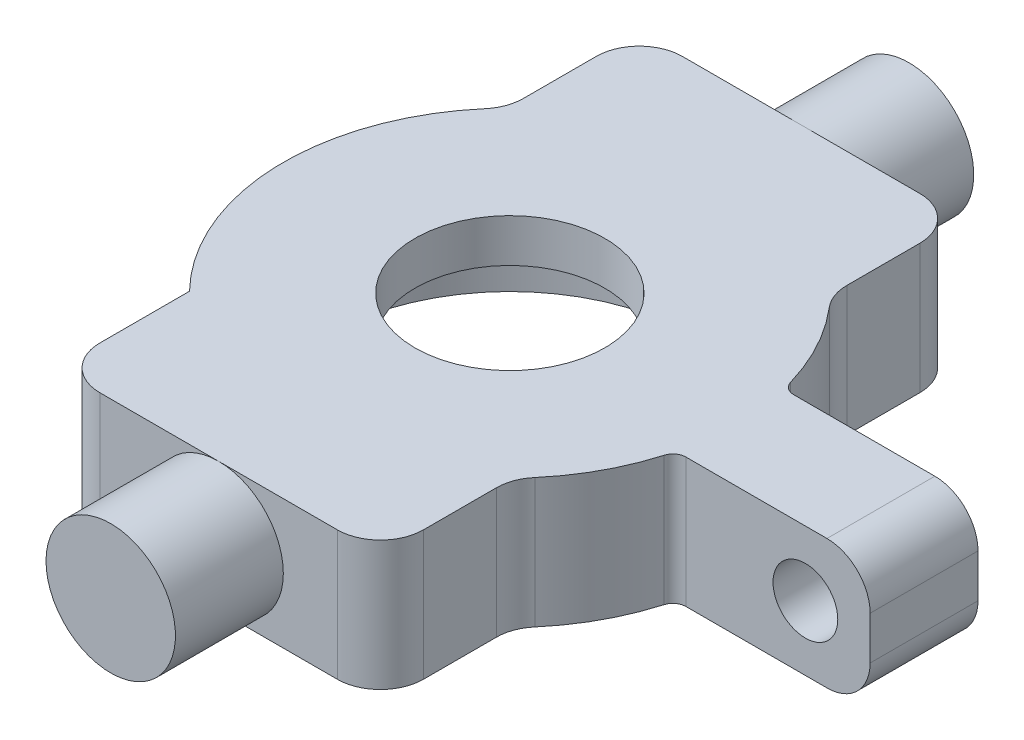
ISO-10303-21;
HEADER;
FILE_DESCRIPTION(('STEP AP214'),'2;1');
FILE_NAME('part.step','',(''),(''),'','','');
FILE_SCHEMA(('AUTOMOTIVE_DESIGN { 1 0 10303 214 1 1 1 1 }'));
ENDSEC;
DATA;
#1=APPLICATION_CONTEXT('core data for automotive mechanical design processes');
#2=APPLICATION_PROTOCOL_DEFINITION('international standard','automotive_design',2000,#1);
#3=PRODUCT_CONTEXT('',#1,'mechanical');
#4=PRODUCT('Part','Part','',(#3));
#5=PRODUCT_RELATED_PRODUCT_CATEGORY('part','',(#4));
#6=PRODUCT_DEFINITION_FORMATION('','',#4);
#7=PRODUCT_DEFINITION_CONTEXT('part definition',#1,'design');
#8=PRODUCT_DEFINITION('design','',#6,#7);
#9=PRODUCT_DEFINITION_SHAPE('','',#8);
#10=(LENGTH_UNIT() NAMED_UNIT(*) SI_UNIT(.MILLI.,.METRE.));
#11=(NAMED_UNIT(*) PLANE_ANGLE_UNIT() SI_UNIT($,.RADIAN.));
#12=(NAMED_UNIT(*) SI_UNIT($,.STERADIAN.) SOLID_ANGLE_UNIT());
#13=UNCERTAINTY_MEASURE_WITH_UNIT(LENGTH_MEASURE(1.E-05),#10,'distance_accuracy_value','');
#14=(GEOMETRIC_REPRESENTATION_CONTEXT(3) GLOBAL_UNCERTAINTY_ASSIGNED_CONTEXT((#13)) GLOBAL_UNIT_ASSIGNED_CONTEXT((#10,
#11,#12)) REPRESENTATION_CONTEXT('',''));
#15=CARTESIAN_POINT('',(0.,0.,0.));
#16=DIRECTION('',(0.,0.,1.));
#17=DIRECTION('',(1.,0.,0.));
#18=AXIS2_PLACEMENT_3D('',#15,#16,#17);
#19=CARTESIAN_POINT('',(0.,30.,0.));
#20=DIRECTION('',(0.,1.,0.));
#21=DIRECTION('',(0.,0.,-1.));
#22=AXIS2_PLACEMENT_3D('',#19,#20,#21);
#23=CYLINDRICAL_SURFACE('',#22,10.5);
#24=CARTESIAN_POINT('',(0.,26.,0.));
#25=DIRECTION('',(0.,1.,0.));
#26=DIRECTION('',(0.,0.,1.));
#27=AXIS2_PLACEMENT_3D('',#24,#25,#26);
#28=CIRCLE('',#27,10.5);
#29=CARTESIAN_POINT('',(10.0822041255481,26.,-2.93243243243243));
#30=VERTEX_POINT('',#29);
#31=CARTESIAN_POINT('',(7.98,26.,-6.82419225989421));
#32=VERTEX_POINT('',#31);
#33=EDGE_CURVE('E403',#30,#32,#28,.T.);
#34=ORIENTED_EDGE('',*,*,#33,.T.);
#35=DIRECTION('',(0.,1.,0.));
#36=VECTOR('',#35,1.);
#37=CARTESIAN_POINT('',(7.98,30.,-6.82419225989421));
#38=LINE('',#37,#36);
#39=CARTESIAN_POINT('',(7.98,32.,-6.82419225989421));
#40=VERTEX_POINT('',#39);
#41=EDGE_CURVE('E333',#40,#32,#38,.F.);
#42=ORIENTED_EDGE('',*,*,#41,.F.);
#43=CARTESIAN_POINT('',(0.,32.,0.));
#44=DIRECTION('',(0.,1.,0.));
#45=DIRECTION('',(0.,0.,1.));
#46=AXIS2_PLACEMENT_3D('',#43,#44,#45);
#47=CIRCLE('',#46,10.5);
#48=CARTESIAN_POINT('',(10.0822041255481,32.,-2.93243243243243));
#49=VERTEX_POINT('',#48);
#50=EDGE_CURVE('E265',#49,#40,#47,.T.);
#51=ORIENTED_EDGE('',*,*,#50,.F.);
#52=DIRECTION('',(0.,1.,0.));
#53=VECTOR('',#52,1.);
#54=CARTESIAN_POINT('',(10.0822041255481,30.,-2.93243243243243));
#55=LINE('',#54,#53);
#56=EDGE_CURVE('E381',#30,#49,#55,.T.);
#57=ORIENTED_EDGE('',*,*,#56,.F.);
#58=EDGE_LOOP('',(#34,#42,#51,#57));
#59=FACE_BOUND('',#58,.T.);
#60=ADVANCED_FACE('F43',(#59),#23,.T.);
#61=CARTESIAN_POINT('',(0.,26.,13.5));
#62=DIRECTION('',(0.,0.,-1.));
#63=DIRECTION('',(-1.,0.,0.));
#64=AXIS2_PLACEMENT_3D('',#61,#62,#63);
#65=PLANE('',#64);
#66=DIRECTION('',(1.,0.,0.));
#67=VECTOR('',#66,1.);
#68=CARTESIAN_POINT('',(0.,32.,13.5));
#69=LINE('',#68,#67);
#70=CARTESIAN_POINT('',(0.,32.,13.5));
#71=VERTEX_POINT('',#70);
#72=CARTESIAN_POINT('',(5.5,32.,13.5));
#73=VERTEX_POINT('',#72);
#74=EDGE_CURVE('E229',#71,#73,#69,.T.);
#75=ORIENTED_EDGE('',*,*,#74,.F.);
#76=CARTESIAN_POINT('',(0.,29.,13.5));
#77=DIRECTION('',(0.,0.,1.));
#78=DIRECTION('',(-1.,0.,0.));
#79=AXIS2_PLACEMENT_3D('',#76,#77,#78);
#80=CIRCLE('',#79,3.);
#81=CARTESIAN_POINT('',(0.,26.,13.5));
#82=VERTEX_POINT('',#81);
#83=EDGE_CURVE('E222',#82,#71,#80,.T.);
#84=ORIENTED_EDGE('',*,*,#83,.F.);
#85=DIRECTION('',(1.,0.,0.));
#86=VECTOR('',#85,1.);
#87=CARTESIAN_POINT('',(0.,26.,13.5));
#88=LINE('',#87,#86);
#89=CARTESIAN_POINT('',(5.5,26.,13.5));
#90=VERTEX_POINT('',#89);
#91=EDGE_CURVE('E445',#82,#90,#88,.T.);
#92=ORIENTED_EDGE('',*,*,#91,.T.);
#93=DIRECTION('',(0.,1.,0.));
#94=VECTOR('',#93,1.);
#95=CARTESIAN_POINT('',(5.5,26.,13.5));
#96=LINE('',#95,#94);
#97=EDGE_CURVE('E244',#73,#90,#96,.F.);
#98=ORIENTED_EDGE('',*,*,#97,.F.);
#99=EDGE_LOOP('',(#75,#84,#92,#98));
#100=FACE_BOUND('',#99,.T.);
#101=ADVANCED_FACE('F242',(#100),#65,.F.);
#102=CARTESIAN_POINT('',(0.,26.,-13.5));
#103=DIRECTION('',(0.,0.,-1.));
#104=DIRECTION('',(-1.,0.,0.));
#105=AXIS2_PLACEMENT_3D('',#102,#103,#104);
#106=PLANE('',#105);
#107=DIRECTION('',(1.,0.,0.));
#108=VECTOR('',#107,1.);
#109=CARTESIAN_POINT('',(0.,26.,-13.5));
#110=LINE('',#109,#108);
#111=CARTESIAN_POINT('',(0.,26.,-13.5));
#112=VERTEX_POINT('',#111);
#113=CARTESIAN_POINT('',(5.5,26.,-13.5));
#114=VERTEX_POINT('',#113);
#115=EDGE_CURVE('E272',#112,#114,#110,.T.);
#116=ORIENTED_EDGE('',*,*,#115,.F.);
#117=CARTESIAN_POINT('',(0.,29.,-13.5));
#118=DIRECTION('',(0.,0.,1.));
#119=DIRECTION('',(-1.,0.,0.));
#120=AXIS2_PLACEMENT_3D('',#117,#118,#119);
#121=CIRCLE('',#120,3.);
#122=CARTESIAN_POINT('',(0.,32.,-13.5));
#123=VERTEX_POINT('',#122);
#124=EDGE_CURVE('E434',#112,#123,#121,.T.);
#125=ORIENTED_EDGE('',*,*,#124,.T.);
#126=DIRECTION('',(1.,0.,0.));
#127=VECTOR('',#126,1.);
#128=CARTESIAN_POINT('',(0.,32.,-13.5));
#129=LINE('',#128,#127);
#130=CARTESIAN_POINT('',(5.5,32.,-13.5));
#131=VERTEX_POINT('',#130);
#132=EDGE_CURVE('E282',#123,#131,#129,.T.);
#133=ORIENTED_EDGE('',*,*,#132,.T.);
#134=DIRECTION('',(0.,1.,0.));
#135=VECTOR('',#134,1.);
#136=CARTESIAN_POINT('',(5.5,26.,-13.5));
#137=LINE('',#136,#135);
#138=EDGE_CURVE('E324',#114,#131,#137,.T.);
#139=ORIENTED_EDGE('',*,*,#138,.F.);
#140=EDGE_LOOP('',(#116,#125,#133,#139));
#141=FACE_BOUND('',#140,.T.);
#142=ADVANCED_FACE('F496',(#141),#106,.T.);
#143=CARTESIAN_POINT('',(0.,30.,0.));
#144=DIRECTION('',(0.,-1.,0.));
#145=DIRECTION('',(0.,0.,1.));
#146=AXIS2_PLACEMENT_3D('',#143,#144,#145);
#147=PLANE('',#146);
#148=CARTESIAN_POINT('',(0.,30.,0.));
#149=DIRECTION('',(0.,1.,0.));
#150=DIRECTION('',(0.,0.,1.));
#151=AXIS2_PLACEMENT_3D('',#148,#149,#150);
#152=CIRCLE('',#151,4.4);
#153=CARTESIAN_POINT('',(0.,30.,4.4));
#154=VERTEX_POINT('',#153);
#155=EDGE_CURVE('E258',#154,#154,#152,.T.);
#156=ORIENTED_EDGE('',*,*,#155,.T.);
#157=EDGE_LOOP('',(#156));
#158=FACE_BOUND('',#157,.T.);
#159=CARTESIAN_POINT('',(0.,30.,0.));
#160=DIRECTION('',(0.,1.,0.));
#161=DIRECTION('',(0.,0.,1.));
#162=AXIS2_PLACEMENT_3D('',#159,#160,#161);
#163=CIRCLE('',#162,8.575);
#164=CARTESIAN_POINT('',(0.,30.,8.575));
#165=VERTEX_POINT('',#164);
#166=EDGE_CURVE('E279',#165,#165,#163,.F.);
#167=ORIENTED_EDGE('',*,*,#166,.T.);
#168=EDGE_LOOP('',(#167));
#169=FACE_BOUND('',#168,.T.);
#170=ADVANCED_FACE('F511',(#158,#169),#147,.T.);
#171=CARTESIAN_POINT('',(-7.98,26.,-6.82419225989421));
#172=VERTEX_POINT('',#171);
#173=CARTESIAN_POINT('',(-7.5,26.,7.34846922834954));
#174=VERTEX_POINT('',#173);
#175=EDGE_CURVE('E405',#172,#174,#28,.T.);
#176=ORIENTED_EDGE('',*,*,#175,.T.);
#177=DIRECTION('',(0.,1.,0.));
#178=VECTOR('',#177,1.);
#179=CARTESIAN_POINT('',(-7.5,26.,7.34846922834954));
#180=LINE('',#179,#178);
#181=CARTESIAN_POINT('',(-7.5,32.,7.34846922834954));
#182=VERTEX_POINT('',#181);
#183=EDGE_CURVE('E253',#174,#182,#180,.T.);
#184=ORIENTED_EDGE('',*,*,#183,.T.);
#185=CARTESIAN_POINT('',(-7.98,32.,-6.82419225989421));
#186=VERTEX_POINT('',#185);
#187=EDGE_CURVE('E262',#186,#182,#47,.T.);
#188=ORIENTED_EDGE('',*,*,#187,.F.);
#189=DIRECTION('',(0.,1.,0.));
#190=VECTOR('',#189,1.);
#191=CARTESIAN_POINT('',(-7.98,30.,-6.82419225989421));
#192=LINE('',#191,#190);
#193=EDGE_CURVE('E219',#172,#186,#192,.T.);
#194=ORIENTED_EDGE('',*,*,#193,.F.);
#195=EDGE_LOOP('',(#176,#184,#188,#194));
#196=FACE_BOUND('',#195,.T.);
#197=ADVANCED_FACE('F465',(#196),#23,.T.);
#198=CARTESIAN_POINT('',(7.5,26.,0.));
#199=DIRECTION('',(1.,0.,0.));
#200=DIRECTION('',(0.,0.,-1.));
#201=AXIS2_PLACEMENT_3D('',#198,#199,#200);
#202=PLANE('',#201);
#203=DIRECTION('',(0.,0.,1.));
#204=VECTOR('',#203,1.);
#205=CARTESIAN_POINT('',(7.5,32.,0.));
#206=LINE('',#205,#204);
#207=CARTESIAN_POINT('',(7.5,32.,-11.5));
#208=VERTEX_POINT('',#207);
#209=CARTESIAN_POINT('',(7.5,32.,-8.12403840463596));
#210=VERTEX_POINT('',#209);
#211=EDGE_CURVE('E261',#208,#210,#206,.T.);
#212=ORIENTED_EDGE('',*,*,#211,.T.);
#213=DIRECTION('',(0.,1.,0.));
#214=VECTOR('',#213,1.);
#215=CARTESIAN_POINT('',(7.5,26.,-8.12403840463596));
#216=LINE('',#215,#214);
#217=CARTESIAN_POINT('',(7.5,26.,-8.12403840463596));
#218=VERTEX_POINT('',#217);
#219=EDGE_CURVE('E327',#218,#210,#216,.T.);
#220=ORIENTED_EDGE('',*,*,#219,.F.);
#221=DIRECTION('',(0.,0.,1.));
#222=VECTOR('',#221,1.);
#223=CARTESIAN_POINT('',(7.5,26.,0.));
#224=LINE('',#223,#222);
#225=CARTESIAN_POINT('',(7.5,26.,-11.5));
#226=VERTEX_POINT('',#225);
#227=EDGE_CURVE('E269',#226,#218,#224,.T.);
#228=ORIENTED_EDGE('',*,*,#227,.F.);
#229=DIRECTION('',(0.,1.,0.));
#230=VECTOR('',#229,1.);
#231=CARTESIAN_POINT('',(7.5,26.,-11.5));
#232=LINE('',#231,#230);
#233=EDGE_CURVE('E330',#208,#226,#232,.F.);
#234=ORIENTED_EDGE('',*,*,#233,.F.);
#235=EDGE_LOOP('',(#212,#220,#228,#234));
#236=FACE_BOUND('',#235,.T.);
#237=ADVANCED_FACE('F503',(#236),#202,.T.);
#238=CARTESIAN_POINT('',(-5.5,32.,-13.5));
#239=VERTEX_POINT('',#238);
#240=EDGE_CURVE('E283',#239,#123,#129,.T.);
#241=ORIENTED_EDGE('',*,*,#240,.T.);
#242=EDGE_CURVE('E220',#123,#112,#121,.T.);
#243=ORIENTED_EDGE('',*,*,#242,.T.);
#244=CARTESIAN_POINT('',(-5.5,26.,-13.5));
#245=VERTEX_POINT('',#244);
#246=EDGE_CURVE('E274',#245,#112,#110,.T.);
#247=ORIENTED_EDGE('',*,*,#246,.F.);
#248=DIRECTION('',(0.,1.,0.));
#249=VECTOR('',#248,1.);
#250=CARTESIAN_POINT('',(-5.5,26.,-13.5));
#251=LINE('',#250,#249);
#252=EDGE_CURVE('E308',#239,#245,#251,.F.);
#253=ORIENTED_EDGE('',*,*,#252,.F.);
#254=EDGE_LOOP('',(#241,#243,#247,#253));
#255=FACE_BOUND('',#254,.T.);
#256=ADVANCED_FACE('F490',(#255),#106,.T.);
#257=CARTESIAN_POINT('',(-7.5,26.,0.));
#258=DIRECTION('',(-1.,0.,0.));
#259=DIRECTION('',(0.,0.,1.));
#260=AXIS2_PLACEMENT_3D('',#257,#258,#259);
#261=PLANE('',#260);
#262=DIRECTION('',(0.,0.,-1.));
#263=VECTOR('',#262,1.);
#264=CARTESIAN_POINT('',(-7.5,32.,0.));
#265=LINE('',#264,#263);
#266=CARTESIAN_POINT('',(-7.5,32.,-8.12403840463596));
#267=VERTEX_POINT('',#266);
#268=CARTESIAN_POINT('',(-7.5,32.,-11.5));
#269=VERTEX_POINT('',#268);
#270=EDGE_CURVE('E273',#267,#269,#265,.T.);
#271=ORIENTED_EDGE('',*,*,#270,.T.);
#272=DIRECTION('',(0.,1.,0.));
#273=VECTOR('',#272,1.);
#274=CARTESIAN_POINT('',(-7.5,26.,-11.5));
#275=LINE('',#274,#273);
#276=CARTESIAN_POINT('',(-7.5,26.,-11.5));
#277=VERTEX_POINT('',#276);
#278=EDGE_CURVE('E292',#277,#269,#275,.T.);
#279=ORIENTED_EDGE('',*,*,#278,.F.);
#280=DIRECTION('',(0.,0.,-1.));
#281=VECTOR('',#280,1.);
#282=CARTESIAN_POINT('',(-7.5,26.,0.));
#283=LINE('',#282,#281);
#284=CARTESIAN_POINT('',(-7.5,26.,-8.12403840463596));
#285=VERTEX_POINT('',#284);
#286=EDGE_CURVE('E276',#285,#277,#283,.T.);
#287=ORIENTED_EDGE('',*,*,#286,.F.);
#288=DIRECTION('',(0.,1.,0.));
#289=VECTOR('',#288,1.);
#290=CARTESIAN_POINT('',(-7.5,26.,-8.12403840463596));
#291=LINE('',#290,#289);
#292=EDGE_CURVE('E295',#267,#285,#291,.F.);
#293=ORIENTED_EDGE('',*,*,#292,.F.);
#294=EDGE_LOOP('',(#271,#279,#287,#293));
#295=FACE_BOUND('',#294,.T.);
#296=ADVANCED_FACE('F482',(#295),#261,.T.);
#297=CARTESIAN_POINT('',(0.,26.,0.));
#298=DIRECTION('',(0.,-1.,0.));
#299=DIRECTION('',(0.,0.,1.));
#300=AXIS2_PLACEMENT_3D('',#297,#298,#299);
#301=PLANE('',#300);
#302=ORIENTED_EDGE('',*,*,#246,.T.);
#303=ORIENTED_EDGE('',*,*,#115,.T.);
#304=CARTESIAN_POINT('',(5.5,26.,-11.5));
#305=DIRECTION('',(0.,1.,0.));
#306=DIRECTION('',(0.,0.,1.));
#307=AXIS2_PLACEMENT_3D('',#304,#305,#306);
#308=CIRCLE('',#307,2.);
#309=EDGE_CURVE('E320',#226,#114,#308,.T.);
#310=ORIENTED_EDGE('',*,*,#309,.F.);
#311=ORIENTED_EDGE('',*,*,#227,.T.);
#312=CARTESIAN_POINT('',(9.5,26.,-8.12403840463596));
#313=DIRECTION('',(0.,1.,0.));
#314=DIRECTION('',(0.,0.,1.));
#315=AXIS2_PLACEMENT_3D('',#312,#313,#314);
#316=CIRCLE('',#315,2.);
#317=EDGE_CURVE('E367',#32,#218,#316,.F.);
#318=ORIENTED_EDGE('',*,*,#317,.F.);
#319=ORIENTED_EDGE('',*,*,#33,.F.);
#320=CARTESIAN_POINT('',(10.6583300755794,26.,-3.1));
#321=DIRECTION('',(0.,1.,0.));
#322=DIRECTION('',(0.,0.,1.));
#323=AXIS2_PLACEMENT_3D('',#320,#321,#322);
#324=CIRCLE('',#323,0.6);
#325=CARTESIAN_POINT('',(10.6583300755794,26.,-2.5));
#326=VERTEX_POINT('',#325);
#327=EDGE_CURVE('E51',#326,#30,#324,.F.);
#328=ORIENTED_EDGE('',*,*,#327,.F.);
#329=DIRECTION('',(-1.,0.,0.));
#330=VECTOR('',#329,1.);
#331=CARTESIAN_POINT('',(10.1980390271856,26.,-2.5));
#332=LINE('',#331,#330);
#333=CARTESIAN_POINT('',(17.1980390271856,26.,-2.5));
#334=VERTEX_POINT('',#333);
#335=EDGE_CURVE('E414',#334,#326,#332,.T.);
#336=ORIENTED_EDGE('',*,*,#335,.F.);
#337=DIRECTION('',(0.,0.,-1.));
#338=VECTOR('',#337,1.);
#339=CARTESIAN_POINT('',(17.1980390271856,26.,0.));
#340=LINE('',#339,#338);
#341=CARTESIAN_POINT('',(17.1980390271856,26.,2.5));
#342=VERTEX_POINT('',#341);
#343=EDGE_CURVE('E311',#342,#334,#340,.T.);
#344=ORIENTED_EDGE('',*,*,#343,.F.);
#345=DIRECTION('',(1.,0.,0.));
#346=VECTOR('',#345,1.);
#347=CARTESIAN_POINT('',(10.1980390271856,26.,2.5));
#348=LINE('',#347,#346);
#349=CARTESIAN_POINT('',(10.6583300755794,26.,2.5));
#350=VERTEX_POINT('',#349);
#351=EDGE_CURVE('E411',#350,#342,#348,.T.);
#352=ORIENTED_EDGE('',*,*,#351,.F.);
#353=CARTESIAN_POINT('',(10.6583300755794,26.,3.1));
#354=DIRECTION('',(0.,1.,0.));
#355=DIRECTION('',(0.,0.,1.));
#356=AXIS2_PLACEMENT_3D('',#353,#354,#355);
#357=CIRCLE('',#356,0.6);
#358=CARTESIAN_POINT('',(10.0822041255481,26.,2.93243243243243));
#359=VERTEX_POINT('',#358);
#360=EDGE_CURVE('E383',#359,#350,#357,.F.);
#361=ORIENTED_EDGE('',*,*,#360,.F.);
#362=CARTESIAN_POINT('',(7.98,26.,6.82419225989421));
#363=VERTEX_POINT('',#362);
#364=EDGE_CURVE('E246',#363,#359,#28,.T.);
#365=ORIENTED_EDGE('',*,*,#364,.F.);
#366=CARTESIAN_POINT('',(9.5,26.,8.12403840463596));
#367=DIRECTION('',(0.,1.,0.));
#368=DIRECTION('',(0.,0.,1.));
#369=AXIS2_PLACEMENT_3D('',#366,#367,#368);
#370=CIRCLE('',#369,2.);
#371=CARTESIAN_POINT('',(7.5,26.,8.12403840463596));
#372=VERTEX_POINT('',#371);
#373=EDGE_CURVE('E372',#372,#363,#370,.F.);
#374=ORIENTED_EDGE('',*,*,#373,.F.);
#375=DIRECTION('',(0.,0.,1.));
#376=VECTOR('',#375,1.);
#377=CARTESIAN_POINT('',(7.5,26.,0.));
#378=LINE('',#377,#376);
#379=CARTESIAN_POINT('',(7.5,26.,11.5));
#380=VERTEX_POINT('',#379);
#381=EDGE_CURVE('E257',#372,#380,#378,.T.);
#382=ORIENTED_EDGE('',*,*,#381,.T.);
#383=CARTESIAN_POINT('',(5.5,26.,11.5));
#384=DIRECTION('',(0.,1.,0.));
#385=DIRECTION('',(0.,0.,1.));
#386=AXIS2_PLACEMENT_3D('',#383,#384,#385);
#387=CIRCLE('',#386,2.);
#388=EDGE_CURVE('E314',#90,#380,#387,.T.);
#389=ORIENTED_EDGE('',*,*,#388,.F.);
#390=ORIENTED_EDGE('',*,*,#91,.F.);
#391=CARTESIAN_POINT('',(-5.5,26.,13.5));
#392=VERTEX_POINT('',#391);
#393=EDGE_CURVE('E215',#392,#82,#88,.T.);
#394=ORIENTED_EDGE('',*,*,#393,.F.);
#395=CARTESIAN_POINT('',(-5.5,26.,11.5));
#396=DIRECTION('',(0.,1.,0.));
#397=DIRECTION('',(0.,0.,1.));
#398=AXIS2_PLACEMENT_3D('',#395,#396,#397);
#399=CIRCLE('',#398,2.);
#400=CARTESIAN_POINT('',(-7.5,26.,11.5));
#401=VERTEX_POINT('',#400);
#402=EDGE_CURVE('E317',#401,#392,#399,.T.);
#403=ORIENTED_EDGE('',*,*,#402,.F.);
#404=DIRECTION('',(0.,0.,-1.));
#405=VECTOR('',#404,1.);
#406=CARTESIAN_POINT('',(-7.5,26.,0.));
#407=LINE('',#406,#405);
#408=EDGE_CURVE('E252',#401,#174,#407,.T.);
#409=ORIENTED_EDGE('',*,*,#408,.T.);
#410=ORIENTED_EDGE('',*,*,#175,.F.);
#411=CARTESIAN_POINT('',(-9.5,26.,-8.12403840463596));
#412=DIRECTION('',(0.,1.,0.));
#413=DIRECTION('',(0.,0.,1.));
#414=AXIS2_PLACEMENT_3D('',#411,#412,#413);
#415=CIRCLE('',#414,2.);
#416=EDGE_CURVE('E363',#285,#172,#415,.F.);
#417=ORIENTED_EDGE('',*,*,#416,.F.);
#418=ORIENTED_EDGE('',*,*,#286,.T.);
#419=CARTESIAN_POINT('',(-5.5,26.,-11.5));
#420=DIRECTION('',(0.,1.,0.));
#421=DIRECTION('',(0.,0.,1.));
#422=AXIS2_PLACEMENT_3D('',#419,#420,#421);
#423=CIRCLE('',#422,2.);
#424=EDGE_CURVE('E322',#245,#277,#423,.T.);
#425=ORIENTED_EDGE('',*,*,#424,.F.);
#426=EDGE_LOOP('',(#302,#303,#310,#311,#318,#319,#328,#336,#344,#352,#361,#365,#374,#382,#389,
#390,#394,#403,#409,#410,#417,#418,#425));
#427=FACE_BOUND('',#426,.T.);
#428=CARTESIAN_POINT('',(0.,26.,0.));
#429=DIRECTION('',(0.,1.,0.));
#430=DIRECTION('',(0.,0.,1.));
#431=AXIS2_PLACEMENT_3D('',#428,#429,#430);
#432=CIRCLE('',#431,8.575);
#433=CARTESIAN_POINT('',(0.,26.,8.575));
#434=VERTEX_POINT('',#433);
#435=EDGE_CURVE('E439',#434,#434,#432,.T.);
#436=ORIENTED_EDGE('',*,*,#435,.T.);
#437=EDGE_LOOP('',(#436));
#438=FACE_BOUND('',#437,.T.);
#439=ADVANCED_FACE('F407',(#427,#438),#301,.T.);
#440=CARTESIAN_POINT('',(0.,32.,0.));
#441=DIRECTION('',(0.,-1.,0.));
#442=DIRECTION('',(0.,0.,1.));
#443=AXIS2_PLACEMENT_3D('',#440,#441,#442);
#444=PLANE('',#443);
#445=ORIENTED_EDGE('',*,*,#270,.F.);
#446=CARTESIAN_POINT('',(-9.5,32.,-8.12403840463596));
#447=DIRECTION('',(0.,1.,0.));
#448=DIRECTION('',(0.,0.,1.));
#449=AXIS2_PLACEMENT_3D('',#446,#447,#448);
#450=CIRCLE('',#449,2.);
#451=EDGE_CURVE('E361',#186,#267,#450,.T.);
#452=ORIENTED_EDGE('',*,*,#451,.F.);
#453=ORIENTED_EDGE('',*,*,#187,.T.);
#454=DIRECTION('',(0.,0.,-1.));
#455=VECTOR('',#454,1.);
#456=CARTESIAN_POINT('',(-7.5,32.,0.));
#457=LINE('',#456,#455);
#458=CARTESIAN_POINT('',(-7.5,32.,11.5));
#459=VERTEX_POINT('',#458);
#460=EDGE_CURVE('E245',#459,#182,#457,.T.);
#461=ORIENTED_EDGE('',*,*,#460,.F.);
#462=CARTESIAN_POINT('',(-5.5,32.,11.5));
#463=DIRECTION('',(0.,1.,0.));
#464=DIRECTION('',(0.,0.,1.));
#465=AXIS2_PLACEMENT_3D('',#462,#463,#464);
#466=CIRCLE('',#465,2.);
#467=CARTESIAN_POINT('',(-5.5,32.,13.5));
#468=VERTEX_POINT('',#467);
#469=EDGE_CURVE('E232',#468,#459,#466,.F.);
#470=ORIENTED_EDGE('',*,*,#469,.F.);
#471=EDGE_CURVE('E212',#468,#71,#69,.T.);
#472=ORIENTED_EDGE('',*,*,#471,.T.);
#473=ORIENTED_EDGE('',*,*,#74,.T.);
#474=CARTESIAN_POINT('',(5.5,32.,11.5));
#475=DIRECTION('',(0.,1.,0.));
#476=DIRECTION('',(0.,0.,1.));
#477=AXIS2_PLACEMENT_3D('',#474,#475,#476);
#478=CIRCLE('',#477,2.);
#479=CARTESIAN_POINT('',(7.5,32.,11.5));
#480=VERTEX_POINT('',#479);
#481=EDGE_CURVE('E301',#480,#73,#478,.F.);
#482=ORIENTED_EDGE('',*,*,#481,.F.);
#483=DIRECTION('',(0.,0.,1.));
#484=VECTOR('',#483,1.);
#485=CARTESIAN_POINT('',(7.5,32.,0.));
#486=LINE('',#485,#484);
#487=CARTESIAN_POINT('',(7.5,32.,8.12403840463596));
#488=VERTEX_POINT('',#487);
#489=EDGE_CURVE('E233',#488,#480,#486,.T.);
#490=ORIENTED_EDGE('',*,*,#489,.F.);
#491=CARTESIAN_POINT('',(9.5,32.,8.12403840463596));
#492=DIRECTION('',(0.,1.,0.));
#493=DIRECTION('',(0.,0.,1.));
#494=AXIS2_PLACEMENT_3D('',#491,#492,#493);
#495=CIRCLE('',#494,2.);
#496=CARTESIAN_POINT('',(7.98,32.,6.82419225989421));
#497=VERTEX_POINT('',#496);
#498=EDGE_CURVE('E369',#497,#488,#495,.T.);
#499=ORIENTED_EDGE('',*,*,#498,.F.);
#500=CARTESIAN_POINT('',(10.0822041255481,32.,2.93243243243243));
#501=VERTEX_POINT('',#500);
#502=EDGE_CURVE('E266',#497,#501,#47,.T.);
#503=ORIENTED_EDGE('',*,*,#502,.T.);
#504=CARTESIAN_POINT('',(10.6583300755794,32.,3.1));
#505=DIRECTION('',(0.,1.,0.));
#506=DIRECTION('',(0.,0.,1.));
#507=AXIS2_PLACEMENT_3D('',#504,#505,#506);
#508=CIRCLE('',#507,0.6);
#509=CARTESIAN_POINT('',(10.6583300755794,32.,2.5));
#510=VERTEX_POINT('',#509);
#511=EDGE_CURVE('E386',#510,#501,#508,.T.);
#512=ORIENTED_EDGE('',*,*,#511,.F.);
#513=DIRECTION('',(-1.,0.,0.));
#514=VECTOR('',#513,1.);
#515=CARTESIAN_POINT('',(10.1980390271856,32.,2.5));
#516=LINE('',#515,#514);
#517=CARTESIAN_POINT('',(17.1980390271856,32.,2.5));
#518=VERTEX_POINT('',#517);
#519=EDGE_CURVE('E240',#518,#510,#516,.T.);
#520=ORIENTED_EDGE('',*,*,#519,.F.);
#521=DIRECTION('',(0.,0.,1.));
#522=VECTOR('',#521,1.);
#523=CARTESIAN_POINT('',(17.1980390271856,32.,2.5));
#524=LINE('',#523,#522);
#525=CARTESIAN_POINT('',(17.1980390271856,32.,-2.5));
#526=VERTEX_POINT('',#525);
#527=EDGE_CURVE('E298',#526,#518,#524,.T.);
#528=ORIENTED_EDGE('',*,*,#527,.F.);
#529=DIRECTION('',(1.,0.,0.));
#530=VECTOR('',#529,1.);
#531=CARTESIAN_POINT('',(10.1980390271856,32.,-2.5));
#532=LINE('',#531,#530);
#533=CARTESIAN_POINT('',(10.6583300755794,32.,-2.5));
#534=VERTEX_POINT('',#533);
#535=EDGE_CURVE('E424',#534,#526,#532,.T.);
#536=ORIENTED_EDGE('',*,*,#535,.F.);
#537=CARTESIAN_POINT('',(10.6583300755794,32.,-3.1));
#538=DIRECTION('',(0.,1.,0.));
#539=DIRECTION('',(0.,0.,1.));
#540=AXIS2_PLACEMENT_3D('',#537,#538,#539);
#541=CIRCLE('',#540,0.6);
#542=EDGE_CURVE('E11',#49,#534,#541,.T.);
#543=ORIENTED_EDGE('',*,*,#542,.F.);
#544=ORIENTED_EDGE('',*,*,#50,.T.);
#545=CARTESIAN_POINT('',(9.5,32.,-8.12403840463596));
#546=DIRECTION('',(0.,1.,0.));
#547=DIRECTION('',(0.,0.,1.));
#548=AXIS2_PLACEMENT_3D('',#545,#546,#547);
#549=CIRCLE('',#548,2.);
#550=EDGE_CURVE('E365',#210,#40,#549,.T.);
#551=ORIENTED_EDGE('',*,*,#550,.F.);
#552=ORIENTED_EDGE('',*,*,#211,.F.);
#553=CARTESIAN_POINT('',(5.5,32.,-11.5));
#554=DIRECTION('',(0.,1.,0.));
#555=DIRECTION('',(0.,0.,1.));
#556=AXIS2_PLACEMENT_3D('',#553,#554,#555);
#557=CIRCLE('',#556,2.);
#558=EDGE_CURVE('E304',#131,#208,#557,.F.);
#559=ORIENTED_EDGE('',*,*,#558,.F.);
#560=ORIENTED_EDGE('',*,*,#132,.F.);
#561=ORIENTED_EDGE('',*,*,#240,.F.);
#562=CARTESIAN_POINT('',(-5.5,32.,-11.5));
#563=DIRECTION('',(0.,1.,0.));
#564=DIRECTION('',(0.,0.,1.));
#565=AXIS2_PLACEMENT_3D('',#562,#563,#564);
#566=CIRCLE('',#565,2.);
#567=EDGE_CURVE('E306',#269,#239,#566,.F.);
#568=ORIENTED_EDGE('',*,*,#567,.F.);
#569=EDGE_LOOP('',(#445,#452,#453,#461,#470,#472,#473,#482,#490,#499,#503,#512,#520,#528,#536,
#543,#544,#551,#552,#559,#560,#561,#568));
#570=FACE_BOUND('',#569,.T.);
#571=CARTESIAN_POINT('',(0.,32.,0.));
#572=DIRECTION('',(0.,1.,0.));
#573=DIRECTION('',(0.,0.,1.));
#574=AXIS2_PLACEMENT_3D('',#571,#572,#573);
#575=CIRCLE('',#574,4.4);
#576=CARTESIAN_POINT('',(0.,32.,4.4));
#577=VERTEX_POINT('',#576);
#578=EDGE_CURVE('E256',#577,#577,#575,.T.);
#579=ORIENTED_EDGE('',*,*,#578,.F.);
#580=EDGE_LOOP('',(#579));
#581=FACE_BOUND('',#580,.T.);
#582=ADVANCED_FACE('F225',(#570,#581),#444,.F.);
#583=CARTESIAN_POINT('',(0.,30.,0.));
#584=DIRECTION('',(0.,1.,0.));
#585=DIRECTION('',(0.,0.,-1.));
#586=AXIS2_PLACEMENT_3D('',#583,#584,#585);
#587=CYLINDRICAL_SURFACE('',#586,4.4);
#588=ORIENTED_EDGE('',*,*,#155,.F.);
#589=EDGE_LOOP('',(#588));
#590=FACE_BOUND('',#589,.T.);
#591=ORIENTED_EDGE('',*,*,#578,.T.);
#592=EDGE_LOOP('',(#591));
#593=FACE_BOUND('',#592,.T.);
#594=ADVANCED_FACE('F522',(#590,#593),#587,.F.);
#595=ORIENTED_EDGE('',*,*,#502,.F.);
#596=DIRECTION('',(0.,1.,0.));
#597=VECTOR('',#596,1.);
#598=CARTESIAN_POINT('',(7.98,30.,6.82419225989421));
#599=LINE('',#598,#597);
#600=EDGE_CURVE('E336',#363,#497,#599,.T.);
#601=ORIENTED_EDGE('',*,*,#600,.F.);
#602=ORIENTED_EDGE('',*,*,#364,.T.);
#603=DIRECTION('',(0.,1.,0.));
#604=VECTOR('',#603,1.);
#605=CARTESIAN_POINT('',(10.0822041255481,30.,2.93243243243243));
#606=LINE('',#605,#604);
#607=EDGE_CURVE('E375',#501,#359,#606,.F.);
#608=ORIENTED_EDGE('',*,*,#607,.F.);
#609=EDGE_LOOP('',(#595,#601,#602,#608));
#610=FACE_BOUND('',#609,.T.);
#611=ADVANCED_FACE('F398',(#610),#23,.T.);
#612=CARTESIAN_POINT('',(-7.5,26.,0.));
#613=DIRECTION('',(-1.,0.,0.));
#614=DIRECTION('',(0.,0.,1.));
#615=AXIS2_PLACEMENT_3D('',#612,#613,#614);
#616=PLANE('',#615);
#617=ORIENTED_EDGE('',*,*,#460,.T.);
#618=ORIENTED_EDGE('',*,*,#183,.F.);
#619=ORIENTED_EDGE('',*,*,#408,.F.);
#620=DIRECTION('',(0.,1.,0.));
#621=VECTOR('',#620,1.);
#622=CARTESIAN_POINT('',(-7.5,26.,11.5));
#623=LINE('',#622,#621);
#624=EDGE_CURVE('E344',#459,#401,#623,.F.);
#625=ORIENTED_EDGE('',*,*,#624,.F.);
#626=EDGE_LOOP('',(#617,#618,#619,#625));
#627=FACE_BOUND('',#626,.T.);
#628=ADVANCED_FACE('F459',(#627),#616,.T.);
#629=ORIENTED_EDGE('',*,*,#393,.T.);
#630=EDGE_CURVE('E209',#71,#82,#80,.T.);
#631=ORIENTED_EDGE('',*,*,#630,.F.);
#632=ORIENTED_EDGE('',*,*,#471,.F.);
#633=DIRECTION('',(0.,1.,0.));
#634=VECTOR('',#633,1.);
#635=CARTESIAN_POINT('',(-5.5,32.,13.5));
#636=LINE('',#635,#634);
#637=EDGE_CURVE('E342',#392,#468,#636,.T.);
#638=ORIENTED_EDGE('',*,*,#637,.F.);
#639=EDGE_LOOP('',(#629,#631,#632,#638));
#640=FACE_BOUND('',#639,.T.);
#641=ADVANCED_FACE('F211',(#640),#65,.F.);
#642=CARTESIAN_POINT('',(7.5,26.,0.));
#643=DIRECTION('',(1.,0.,0.));
#644=DIRECTION('',(0.,0.,-1.));
#645=AXIS2_PLACEMENT_3D('',#642,#643,#644);
#646=PLANE('',#645);
#647=ORIENTED_EDGE('',*,*,#489,.T.);
#648=DIRECTION('',(0.,1.,0.));
#649=VECTOR('',#648,1.);
#650=CARTESIAN_POINT('',(7.5,32.,11.5));
#651=LINE('',#650,#649);
#652=EDGE_CURVE('E338',#380,#480,#651,.T.);
#653=ORIENTED_EDGE('',*,*,#652,.F.);
#654=ORIENTED_EDGE('',*,*,#381,.F.);
#655=DIRECTION('',(0.,1.,0.));
#656=VECTOR('',#655,1.);
#657=CARTESIAN_POINT('',(7.5,26.,8.12403840463596));
#658=LINE('',#657,#656);
#659=EDGE_CURVE('E340',#488,#372,#658,.F.);
#660=ORIENTED_EDGE('',*,*,#659,.F.);
#661=EDGE_LOOP('',(#647,#653,#654,#660));
#662=FACE_BOUND('',#661,.T.);
#663=ADVANCED_FACE('F449',(#662),#646,.T.);
#664=CARTESIAN_POINT('',(0.,-3.69848480983501,0.));
#665=DIRECTION('',(0.,1.,0.));
#666=DIRECTION('',(0.,0.,-1.));
#667=AXIS2_PLACEMENT_3D('',#664,#665,#666);
#668=CYLINDRICAL_SURFACE('',#667,8.575);
#669=ORIENTED_EDGE('',*,*,#166,.F.);
#670=EDGE_LOOP('',(#669));
#671=FACE_BOUND('',#670,.T.);
#672=ORIENTED_EDGE('',*,*,#435,.F.);
#673=EDGE_LOOP('',(#672));
#674=FACE_BOUND('',#673,.T.);
#675=ADVANCED_FACE('F605',(#671,#674),#668,.F.);
#676=CARTESIAN_POINT('',(0.,29.,-18.5));
#677=DIRECTION('',(0.,0.,1.));
#678=DIRECTION('',(1.,0.,0.));
#679=AXIS2_PLACEMENT_3D('',#676,#677,#678);
#680=CYLINDRICAL_SURFACE('',#679,3.);
#681=CARTESIAN_POINT('',(0.,29.,-18.5));
#682=DIRECTION('',(0.,0.,1.));
#683=DIRECTION('',(-1.,0.,0.));
#684=AXIS2_PLACEMENT_3D('',#681,#682,#683);
#685=CIRCLE('',#684,3.);
#686=CARTESIAN_POINT('',(-3.,29.,-18.5));
#687=VERTEX_POINT('',#686);
#688=EDGE_CURVE('E436',#687,#687,#685,.T.);
#689=ORIENTED_EDGE('',*,*,#688,.T.);
#690=EDGE_LOOP('',(#689));
#691=FACE_BOUND('',#690,.T.);
#692=ORIENTED_EDGE('',*,*,#124,.F.);
#693=ORIENTED_EDGE('',*,*,#242,.F.);
#694=EDGE_LOOP('',(#692,#693));
#695=FACE_BOUND('',#694,.T.);
#696=ADVANCED_FACE('F618',(#691,#695),#680,.T.);
#697=CARTESIAN_POINT('',(0.,29.,-18.5));
#698=DIRECTION('',(0.,0.,-1.));
#699=DIRECTION('',(-1.,0.,0.));
#700=AXIS2_PLACEMENT_3D('',#697,#698,#699);
#701=PLANE('',#700);
#702=ORIENTED_EDGE('',*,*,#688,.F.);
#703=EDGE_LOOP('',(#702));
#704=FACE_BOUND('',#703,.T.);
#705=ADVANCED_FACE('F629',(#704),#701,.T.);
#706=CARTESIAN_POINT('',(0.,29.,18.5));
#707=DIRECTION('',(0.,0.,-1.));
#708=DIRECTION('',(-1.,0.,0.));
#709=AXIS2_PLACEMENT_3D('',#706,#707,#708);
#710=CYLINDRICAL_SURFACE('',#709,3.);
#711=CARTESIAN_POINT('',(0.,29.,18.5));
#712=DIRECTION('',(0.,0.,1.));
#713=DIRECTION('',(-1.,0.,0.));
#714=AXIS2_PLACEMENT_3D('',#711,#712,#713);
#715=CIRCLE('',#714,3.);
#716=CARTESIAN_POINT('',(-3.,29.,18.5));
#717=VERTEX_POINT('',#716);
#718=EDGE_CURVE('E239',#717,#717,#715,.T.);
#719=ORIENTED_EDGE('',*,*,#718,.F.);
#720=EDGE_LOOP('',(#719));
#721=FACE_BOUND('',#720,.T.);
#722=ORIENTED_EDGE('',*,*,#83,.T.);
#723=ORIENTED_EDGE('',*,*,#630,.T.);
#724=EDGE_LOOP('',(#722,#723));
#725=FACE_BOUND('',#724,.T.);
#726=ADVANCED_FACE('F236',(#721,#725),#710,.T.);
#727=CARTESIAN_POINT('',(0.,29.,18.5));
#728=DIRECTION('',(0.,0.,1.));
#729=DIRECTION('',(-1.,0.,0.));
#730=AXIS2_PLACEMENT_3D('',#727,#728,#729);
#731=PLANE('',#730);
#732=ORIENTED_EDGE('',*,*,#718,.T.);
#733=EDGE_LOOP('',(#732));
#734=FACE_BOUND('',#733,.T.);
#735=ADVANCED_FACE('F648',(#734),#731,.T.);
#736=CARTESIAN_POINT('',(10.1980390271856,42.295630140987,-2.5));
#737=DIRECTION('',(0.,0.,-1.));
#738=DIRECTION('',(-1.,0.,0.));
#739=AXIS2_PLACEMENT_3D('',#736,#737,#738);
#740=PLANE('',#739);
#741=CARTESIAN_POINT('',(16.1980390271856,29.,-2.5));
#742=DIRECTION('',(0.,0.,1.));
#743=DIRECTION('',(-1.,0.,0.));
#744=AXIS2_PLACEMENT_3D('',#741,#742,#743);
#745=CIRCLE('',#744,1.5);
#746=CARTESIAN_POINT('',(14.6980390271856,29.,-2.5));
#747=VERTEX_POINT('',#746);
#748=EDGE_CURVE('E415',#747,#747,#745,.T.);
#749=ORIENTED_EDGE('',*,*,#748,.T.);
#750=EDGE_LOOP('',(#749));
#751=FACE_BOUND('',#750,.T.);
#752=ORIENTED_EDGE('',*,*,#535,.T.);
#753=CARTESIAN_POINT('',(17.1980390271856,30.,-2.5));
#754=DIRECTION('',(0.,0.,1.));
#755=DIRECTION('',(-1.,0.,0.));
#756=AXIS2_PLACEMENT_3D('',#753,#754,#755);
#757=CIRCLE('',#756,2.);
#758=CARTESIAN_POINT('',(19.1980390271856,30.,-2.5));
#759=VERTEX_POINT('',#758);
#760=EDGE_CURVE('E359',#759,#526,#757,.T.);
#761=ORIENTED_EDGE('',*,*,#760,.F.);
#762=DIRECTION('',(0.,-1.,0.));
#763=VECTOR('',#762,1.);
#764=CARTESIAN_POINT('',(19.1980390271856,42.295630140987,-2.5));
#765=LINE('',#764,#763);
#766=CARTESIAN_POINT('',(19.1980390271856,28.,-2.5));
#767=VERTEX_POINT('',#766);
#768=EDGE_CURVE('E427',#759,#767,#765,.T.);
#769=ORIENTED_EDGE('',*,*,#768,.T.);
#770=CARTESIAN_POINT('',(17.1980390271856,28.,-2.5));
#771=DIRECTION('',(0.,0.,1.));
#772=DIRECTION('',(-1.,0.,0.));
#773=AXIS2_PLACEMENT_3D('',#770,#771,#772);
#774=CIRCLE('',#773,2.);
#775=EDGE_CURVE('E356',#334,#767,#774,.T.);
#776=ORIENTED_EDGE('',*,*,#775,.F.);
#777=ORIENTED_EDGE('',*,*,#335,.T.);
#778=DIRECTION('',(0.,1.,0.));
#779=VECTOR('',#778,1.);
#780=CARTESIAN_POINT('',(10.6583300755794,42.295630140987,-2.5));
#781=LINE('',#780,#779);
#782=EDGE_CURVE('E379',#534,#326,#781,.F.);
#783=ORIENTED_EDGE('',*,*,#782,.F.);
#784=EDGE_LOOP('',(#752,#761,#769,#776,#777,#783));
#785=FACE_BOUND('',#784,.T.);
#786=ADVANCED_FACE('F658',(#751,#785),#740,.T.);
#787=CARTESIAN_POINT('',(19.1980390271856,42.295630140987,2.5));
#788=DIRECTION('',(1.,0.,0.));
#789=DIRECTION('',(0.,0.,-1.));
#790=AXIS2_PLACEMENT_3D('',#787,#788,#789);
#791=PLANE('',#790);
#792=DIRECTION('',(0.,-1.,0.));
#793=VECTOR('',#792,1.);
#794=CARTESIAN_POINT('',(19.1980390271856,42.295630140987,2.5));
#795=LINE('',#794,#793);
#796=CARTESIAN_POINT('',(19.1980390271856,30.,2.5));
#797=VERTEX_POINT('',#796);
#798=CARTESIAN_POINT('',(19.1980390271856,28.,2.5));
#799=VERTEX_POINT('',#798);
#800=EDGE_CURVE('E418',#797,#799,#795,.T.);
#801=ORIENTED_EDGE('',*,*,#800,.T.);
#802=DIRECTION('',(0.,0.,-1.));
#803=VECTOR('',#802,1.);
#804=CARTESIAN_POINT('',(19.1980390271856,28.,2.5));
#805=LINE('',#804,#803);
#806=EDGE_CURVE('E351',#767,#799,#805,.F.);
#807=ORIENTED_EDGE('',*,*,#806,.F.);
#808=ORIENTED_EDGE('',*,*,#768,.F.);
#809=DIRECTION('',(0.,0.,1.));
#810=VECTOR('',#809,1.);
#811=CARTESIAN_POINT('',(19.1980390271856,30.,-2.5));
#812=LINE('',#811,#810);
#813=EDGE_CURVE('E354',#797,#759,#812,.F.);
#814=ORIENTED_EDGE('',*,*,#813,.F.);
#815=EDGE_LOOP('',(#801,#807,#808,#814));
#816=FACE_BOUND('',#815,.T.);
#817=ADVANCED_FACE('F669',(#816),#791,.T.);
#818=CARTESIAN_POINT('',(10.1980390271856,42.295630140987,2.5));
#819=DIRECTION('',(0.,0.,1.));
#820=DIRECTION('',(1.,0.,0.));
#821=AXIS2_PLACEMENT_3D('',#818,#819,#820);
#822=PLANE('',#821);
#823=CARTESIAN_POINT('',(16.1980390271856,29.,2.5));
#824=DIRECTION('',(0.,0.,-1.));
#825=DIRECTION('',(1.,0.,0.));
#826=AXIS2_PLACEMENT_3D('',#823,#824,#825);
#827=CIRCLE('',#826,1.5);
#828=CARTESIAN_POINT('',(17.6980390271856,29.,2.5));
#829=VERTEX_POINT('',#828);
#830=EDGE_CURVE('E421',#829,#829,#827,.F.);
#831=ORIENTED_EDGE('',*,*,#830,.F.);
#832=EDGE_LOOP('',(#831));
#833=FACE_BOUND('',#832,.T.);
#834=ORIENTED_EDGE('',*,*,#351,.T.);
#835=CARTESIAN_POINT('',(17.1980390271856,28.,2.5));
#836=DIRECTION('',(0.,0.,-1.));
#837=DIRECTION('',(1.,0.,0.));
#838=AXIS2_PLACEMENT_3D('',#835,#836,#837);
#839=CIRCLE('',#838,2.);
#840=EDGE_CURVE('E347',#799,#342,#839,.T.);
#841=ORIENTED_EDGE('',*,*,#840,.F.);
#842=ORIENTED_EDGE('',*,*,#800,.F.);
#843=CARTESIAN_POINT('',(17.1980390271856,30.,2.5));
#844=DIRECTION('',(0.,0.,-1.));
#845=DIRECTION('',(1.,0.,0.));
#846=AXIS2_PLACEMENT_3D('',#843,#844,#845);
#847=CIRCLE('',#846,2.);
#848=EDGE_CURVE('E349',#518,#797,#847,.T.);
#849=ORIENTED_EDGE('',*,*,#848,.F.);
#850=ORIENTED_EDGE('',*,*,#519,.T.);
#851=DIRECTION('',(0.,1.,0.));
#852=VECTOR('',#851,1.);
#853=CARTESIAN_POINT('',(10.6583300755794,42.295630140987,2.5));
#854=LINE('',#853,#852);
#855=EDGE_CURVE('E377',#350,#510,#854,.T.);
#856=ORIENTED_EDGE('',*,*,#855,.F.);
#857=EDGE_LOOP('',(#834,#841,#842,#849,#850,#856));
#858=FACE_BOUND('',#857,.T.);
#859=ADVANCED_FACE('F680',(#833,#858),#822,.T.);
#860=CARTESIAN_POINT('',(16.1980390271856,29.,18.501));
#861=DIRECTION('',(0.,0.,-1.));
#862=DIRECTION('',(-1.,0.,0.));
#863=AXIS2_PLACEMENT_3D('',#860,#861,#862);
#864=CYLINDRICAL_SURFACE('',#863,1.5);
#865=ORIENTED_EDGE('',*,*,#830,.T.);
#866=EDGE_LOOP('',(#865));
#867=FACE_BOUND('',#866,.T.);
#868=ORIENTED_EDGE('',*,*,#748,.F.);
#869=EDGE_LOOP('',(#868));
#870=FACE_BOUND('',#869,.T.);
#871=ADVANCED_FACE('F690',(#867,#870),#864,.F.);
#872=CARTESIAN_POINT('',(-9.5,30.,-8.12403840463596));
#873=DIRECTION('',(0.,1.,0.));
#874=DIRECTION('',(0.,0.,-1.));
#875=AXIS2_PLACEMENT_3D('',#872,#873,#874);
#876=CYLINDRICAL_SURFACE('',#875,2.);
#877=ORIENTED_EDGE('',*,*,#416,.T.);
#878=ORIENTED_EDGE('',*,*,#193,.T.);
#879=ORIENTED_EDGE('',*,*,#451,.T.);
#880=ORIENTED_EDGE('',*,*,#292,.T.);
#881=EDGE_LOOP('',(#877,#878,#879,#880));
#882=FACE_BOUND('',#881,.T.);
#883=ADVANCED_FACE('F478',(#882),#876,.F.);
#884=CARTESIAN_POINT('',(-5.5,26.,-11.5));
#885=DIRECTION('',(0.,1.,0.));
#886=DIRECTION('',(0.,0.,-1.));
#887=AXIS2_PLACEMENT_3D('',#884,#885,#886);
#888=CYLINDRICAL_SURFACE('',#887,2.);
#889=ORIENTED_EDGE('',*,*,#424,.T.);
#890=ORIENTED_EDGE('',*,*,#278,.T.);
#891=ORIENTED_EDGE('',*,*,#567,.T.);
#892=ORIENTED_EDGE('',*,*,#252,.T.);
#893=EDGE_LOOP('',(#889,#890,#891,#892));
#894=FACE_BOUND('',#893,.T.);
#895=ADVANCED_FACE('F484',(#894),#888,.T.);
#896=CARTESIAN_POINT('',(5.5,26.,-11.5));
#897=DIRECTION('',(0.,1.,0.));
#898=DIRECTION('',(0.,0.,-1.));
#899=AXIS2_PLACEMENT_3D('',#896,#897,#898);
#900=CYLINDRICAL_SURFACE('',#899,2.);
#901=ORIENTED_EDGE('',*,*,#309,.T.);
#902=ORIENTED_EDGE('',*,*,#138,.T.);
#903=ORIENTED_EDGE('',*,*,#558,.T.);
#904=ORIENTED_EDGE('',*,*,#233,.T.);
#905=EDGE_LOOP('',(#901,#902,#903,#904));
#906=FACE_BOUND('',#905,.T.);
#907=ADVANCED_FACE('F500',(#906),#900,.T.);
#908=CARTESIAN_POINT('',(9.5,30.,-8.12403840463596));
#909=DIRECTION('',(0.,1.,0.));
#910=DIRECTION('',(0.,0.,-1.));
#911=AXIS2_PLACEMENT_3D('',#908,#909,#910);
#912=CYLINDRICAL_SURFACE('',#911,2.);
#913=ORIENTED_EDGE('',*,*,#317,.T.);
#914=ORIENTED_EDGE('',*,*,#219,.T.);
#915=ORIENTED_EDGE('',*,*,#550,.T.);
#916=ORIENTED_EDGE('',*,*,#41,.T.);
#917=EDGE_LOOP('',(#913,#914,#915,#916));
#918=FACE_BOUND('',#917,.T.);
#919=ADVANCED_FACE('F474',(#918),#912,.F.);
#920=CARTESIAN_POINT('',(9.5,30.,8.12403840463596));
#921=DIRECTION('',(0.,1.,0.));
#922=DIRECTION('',(0.,0.,-1.));
#923=AXIS2_PLACEMENT_3D('',#920,#921,#922);
#924=CYLINDRICAL_SURFACE('',#923,2.);
#925=ORIENTED_EDGE('',*,*,#373,.T.);
#926=ORIENTED_EDGE('',*,*,#600,.T.);
#927=ORIENTED_EDGE('',*,*,#498,.T.);
#928=ORIENTED_EDGE('',*,*,#659,.T.);
#929=EDGE_LOOP('',(#925,#926,#927,#928));
#930=FACE_BOUND('',#929,.T.);
#931=ADVANCED_FACE('F733',(#930),#924,.F.);
#932=CARTESIAN_POINT('',(-5.5,26.,11.5));
#933=DIRECTION('',(0.,-1.,0.));
#934=DIRECTION('',(0.,0.,1.));
#935=AXIS2_PLACEMENT_3D('',#932,#933,#934);
#936=CYLINDRICAL_SURFACE('',#935,2.);
#937=ORIENTED_EDGE('',*,*,#402,.T.);
#938=ORIENTED_EDGE('',*,*,#637,.T.);
#939=ORIENTED_EDGE('',*,*,#469,.T.);
#940=ORIENTED_EDGE('',*,*,#624,.T.);
#941=EDGE_LOOP('',(#937,#938,#939,#940));
#942=FACE_BOUND('',#941,.T.);
#943=ADVANCED_FACE('F457',(#942),#936,.T.);
#944=CARTESIAN_POINT('',(5.5,26.,11.5));
#945=DIRECTION('',(0.,-1.,0.));
#946=DIRECTION('',(0.,0.,1.));
#947=AXIS2_PLACEMENT_3D('',#944,#945,#946);
#948=CYLINDRICAL_SURFACE('',#947,2.);
#949=ORIENTED_EDGE('',*,*,#388,.T.);
#950=ORIENTED_EDGE('',*,*,#652,.T.);
#951=ORIENTED_EDGE('',*,*,#481,.T.);
#952=ORIENTED_EDGE('',*,*,#97,.T.);
#953=EDGE_LOOP('',(#949,#950,#951,#952));
#954=FACE_BOUND('',#953,.T.);
#955=ADVANCED_FACE('F451',(#954),#948,.T.);
#956=CARTESIAN_POINT('',(17.1980390271856,30.,0.));
#957=DIRECTION('',(0.,0.,-1.));
#958=DIRECTION('',(-1.,0.,0.));
#959=AXIS2_PLACEMENT_3D('',#956,#957,#958);
#960=CYLINDRICAL_SURFACE('',#959,2.);
#961=ORIENTED_EDGE('',*,*,#760,.T.);
#962=ORIENTED_EDGE('',*,*,#527,.T.);
#963=ORIENTED_EDGE('',*,*,#848,.T.);
#964=ORIENTED_EDGE('',*,*,#813,.T.);
#965=EDGE_LOOP('',(#961,#962,#963,#964));
#966=FACE_BOUND('',#965,.T.);
#967=ADVANCED_FACE('F759',(#966),#960,.T.);
#968=CARTESIAN_POINT('',(17.1980390271856,28.,0.));
#969=DIRECTION('',(0.,0.,-1.));
#970=DIRECTION('',(-1.,0.,0.));
#971=AXIS2_PLACEMENT_3D('',#968,#969,#970);
#972=CYLINDRICAL_SURFACE('',#971,2.);
#973=ORIENTED_EDGE('',*,*,#840,.T.);
#974=ORIENTED_EDGE('',*,*,#343,.T.);
#975=ORIENTED_EDGE('',*,*,#775,.T.);
#976=ORIENTED_EDGE('',*,*,#806,.T.);
#977=EDGE_LOOP('',(#973,#974,#975,#976));
#978=FACE_BOUND('',#977,.T.);
#979=ADVANCED_FACE('F768',(#978),#972,.T.);
#980=CARTESIAN_POINT('',(10.6583300755794,30.,3.1));
#981=DIRECTION('',(0.,1.,0.));
#982=DIRECTION('',(0.,0.,-1.));
#983=AXIS2_PLACEMENT_3D('',#980,#981,#982);
#984=CYLINDRICAL_SURFACE('',#983,0.6);
#985=ORIENTED_EDGE('',*,*,#511,.T.);
#986=ORIENTED_EDGE('',*,*,#607,.T.);
#987=ORIENTED_EDGE('',*,*,#360,.T.);
#988=ORIENTED_EDGE('',*,*,#855,.T.);
#989=EDGE_LOOP('',(#985,#986,#987,#988));
#990=FACE_BOUND('',#989,.T.);
#991=ADVANCED_FACE('F390',(#990),#984,.F.);
#992=CARTESIAN_POINT('',(10.6583300755794,30.,-3.1));
#993=DIRECTION('',(0.,1.,0.));
#994=DIRECTION('',(0.,0.,-1.));
#995=AXIS2_PLACEMENT_3D('',#992,#993,#994);
#996=CYLINDRICAL_SURFACE('',#995,0.6);
#997=ORIENTED_EDGE('',*,*,#542,.T.);
#998=ORIENTED_EDGE('',*,*,#782,.T.);
#999=ORIENTED_EDGE('',*,*,#327,.T.);
#1000=ORIENTED_EDGE('',*,*,#56,.T.);
#1001=EDGE_LOOP('',(#997,#998,#999,#1000));
#1002=FACE_BOUND('',#1001,.T.);
#1003=ADVANCED_FACE('F45',(#1002),#996,.F.);
#1004=CLOSED_SHELL('',(#60,#101,#142,#170,#197,#237,#256,#296,#439,#582,#594,#611,#628,#641,
#663,#675,#696,#705,#726,#735,#786,#817,#859,#871,#883,#895,#907,#919,#931,#943,#955,#967,#979,
#991,#1003));
#1005=MANIFOLD_SOLID_BREP('B2',#1004);
#1006=ADVANCED_BREP_SHAPE_REPRESENTATION('',(#18,#1005),#14);
#1007=SHAPE_DEFINITION_REPRESENTATION(#9,#1006);
ENDSEC;
END-ISO-10303-21;
